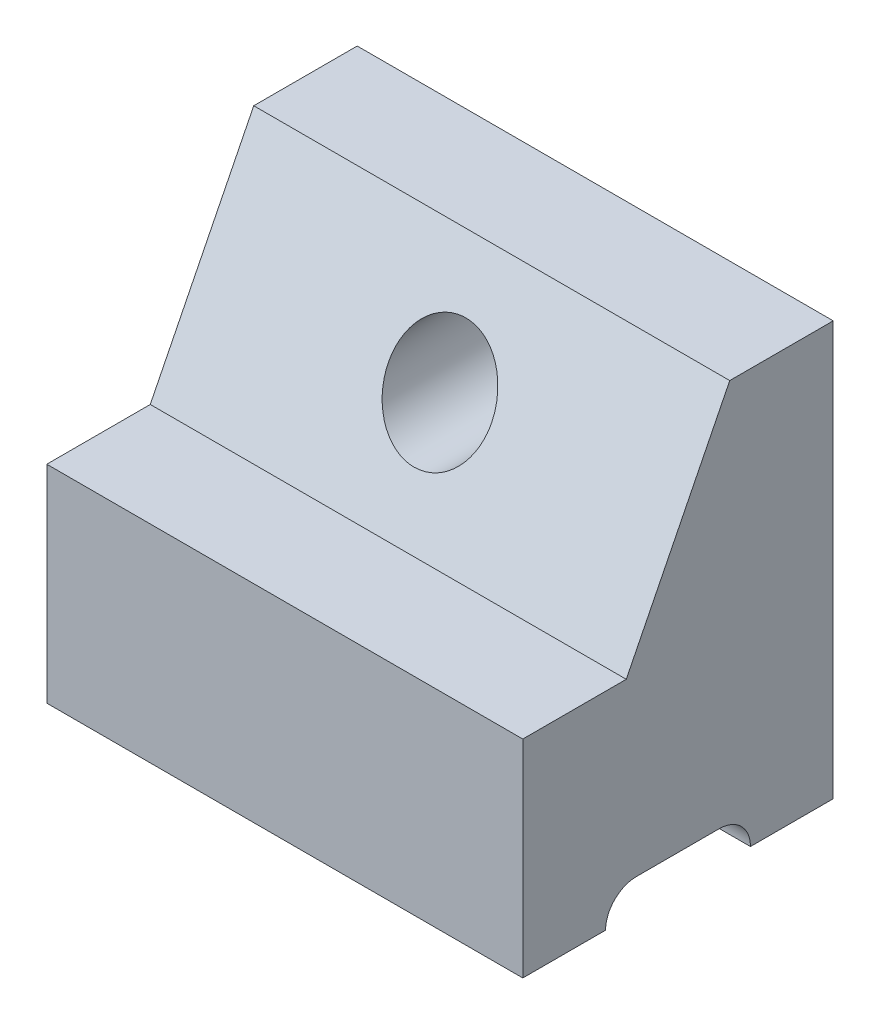
ISO-10303-21;
HEADER;
FILE_DESCRIPTION(('STEP AP214'),'2;1');
FILE_NAME('part.step','',(''),(''),'','','');
FILE_SCHEMA(('AUTOMOTIVE_DESIGN { 1 0 10303 214 1 1 1 1 }'));
ENDSEC;
DATA;
#1=APPLICATION_CONTEXT('core data for automotive mechanical design processes');
#2=APPLICATION_PROTOCOL_DEFINITION('international standard','automotive_design',2000,#1);
#3=PRODUCT_CONTEXT('',#1,'mechanical');
#4=PRODUCT('Part','Part','',(#3));
#5=PRODUCT_RELATED_PRODUCT_CATEGORY('part','',(#4));
#6=PRODUCT_DEFINITION_FORMATION('','',#4);
#7=PRODUCT_DEFINITION_CONTEXT('part definition',#1,'design');
#8=PRODUCT_DEFINITION('design','',#6,#7);
#9=PRODUCT_DEFINITION_SHAPE('','',#8);
#10=(LENGTH_UNIT() NAMED_UNIT(*) SI_UNIT(.MILLI.,.METRE.));
#11=(NAMED_UNIT(*) PLANE_ANGLE_UNIT() SI_UNIT($,.RADIAN.));
#12=(NAMED_UNIT(*) SI_UNIT($,.STERADIAN.) SOLID_ANGLE_UNIT());
#13=UNCERTAINTY_MEASURE_WITH_UNIT(LENGTH_MEASURE(1.E-05),#10,'distance_accuracy_value','');
#14=(GEOMETRIC_REPRESENTATION_CONTEXT(3) GLOBAL_UNCERTAINTY_ASSIGNED_CONTEXT((#13)) GLOBAL_UNIT_ASSIGNED_CONTEXT((#10,
#11,#12)) REPRESENTATION_CONTEXT('',''));
#15=CARTESIAN_POINT('',(0.,0.,0.));
#16=DIRECTION('',(0.,0.,1.));
#17=DIRECTION('',(1.,0.,0.));
#18=AXIS2_PLACEMENT_3D('',#15,#16,#17);
#19=CARTESIAN_POINT('',(-23.,20.,15.));
#20=DIRECTION('',(1.,0.,0.));
#21=DIRECTION('',(0.,1.,0.));
#22=AXIS2_PLACEMENT_3D('',#19,#20,#21);
#23=PLANE('',#22);
#24=DIRECTION('',(0.,-0.894427190999916,0.447213595499958));
#25=VECTOR('',#24,1.);
#26=CARTESIAN_POINT('',(-23.,1.99999999999999,4.));
#27=LINE('',#26,#25);
#28=CARTESIAN_POINT('',(-23.,20.,-5.));
#29=VERTEX_POINT('',#28);
#30=CARTESIAN_POINT('',(-23.,0.,5.));
#31=VERTEX_POINT('',#30);
#32=EDGE_CURVE('E118',#29,#31,#27,.T.);
#33=ORIENTED_EDGE('',*,*,#32,.F.);
#34=DIRECTION('',(0.,0.,-1.));
#35=VECTOR('',#34,1.);
#36=CARTESIAN_POINT('',(-23.,20.,15.));
#37=LINE('',#36,#35);
#38=CARTESIAN_POINT('',(-23.,20.,-15.));
#39=VERTEX_POINT('',#38);
#40=EDGE_CURVE('E195',#29,#39,#37,.T.);
#41=ORIENTED_EDGE('',*,*,#40,.T.);
#42=DIRECTION('',(0.,-1.,0.));
#43=VECTOR('',#42,1.);
#44=CARTESIAN_POINT('',(-23.,20.,-15.));
#45=LINE('',#44,#43);
#46=CARTESIAN_POINT('',(-23.,-20.,-15.));
#47=VERTEX_POINT('',#46);
#48=EDGE_CURVE('E174',#39,#47,#45,.T.);
#49=ORIENTED_EDGE('',*,*,#48,.T.);
#50=DIRECTION('',(0.,0.,-1.));
#51=VECTOR('',#50,1.);
#52=CARTESIAN_POINT('',(-23.,-20.,15.));
#53=LINE('',#52,#51);
#54=CARTESIAN_POINT('',(-23.,-20.,-7.));
#55=VERTEX_POINT('',#54);
#56=EDGE_CURVE('E203',#55,#47,#53,.T.);
#57=ORIENTED_EDGE('',*,*,#56,.F.);
#58=CARTESIAN_POINT('',(-23.,-20.,-4.));
#59=DIRECTION('',(1.,0.,0.));
#60=DIRECTION('',(0.,1.,0.));
#61=AXIS2_PLACEMENT_3D('',#58,#59,#60);
#62=CIRCLE('',#61,3.);
#63=CARTESIAN_POINT('',(-23.,-17.,-4.));
#64=VERTEX_POINT('',#63);
#65=EDGE_CURVE('E11',#55,#64,#62,.T.);
#66=ORIENTED_EDGE('',*,*,#65,.T.);
#67=DIRECTION('',(0.,0.,-1.));
#68=VECTOR('',#67,1.);
#69=CARTESIAN_POINT('',(-23.,-17.,0.));
#70=LINE('',#69,#68);
#71=CARTESIAN_POINT('',(-23.,-17.,4.));
#72=VERTEX_POINT('',#71);
#73=EDGE_CURVE('E150',#72,#64,#70,.T.);
#74=ORIENTED_EDGE('',*,*,#73,.F.);
#75=CARTESIAN_POINT('',(-23.,-20.,4.));
#76=DIRECTION('',(1.,0.,0.));
#77=DIRECTION('',(0.,1.,0.));
#78=AXIS2_PLACEMENT_3D('',#75,#76,#77);
#79=CIRCLE('',#78,3.);
#80=CARTESIAN_POINT('',(-23.,-20.,7.));
#81=VERTEX_POINT('',#80);
#82=EDGE_CURVE('E216',#72,#81,#79,.T.);
#83=ORIENTED_EDGE('',*,*,#82,.T.);
#84=CARTESIAN_POINT('',(-23.,-20.,15.));
#85=VERTEX_POINT('',#84);
#86=EDGE_CURVE('E199',#85,#81,#53,.T.);
#87=ORIENTED_EDGE('',*,*,#86,.F.);
#88=DIRECTION('',(0.,-1.,0.));
#89=VECTOR('',#88,1.);
#90=CARTESIAN_POINT('',(-23.,20.,15.));
#91=LINE('',#90,#89);
#92=CARTESIAN_POINT('',(-23.,0.,15.));
#93=VERTEX_POINT('',#92);
#94=EDGE_CURVE('E137',#93,#85,#91,.T.);
#95=ORIENTED_EDGE('',*,*,#94,.F.);
#96=DIRECTION('',(0.,0.,-1.));
#97=VECTOR('',#96,1.);
#98=CARTESIAN_POINT('',(-23.,0.,0.));
#99=LINE('',#98,#97);
#100=EDGE_CURVE('E56',#93,#31,#99,.T.);
#101=ORIENTED_EDGE('',*,*,#100,.T.);
#102=EDGE_LOOP('',(#33,#41,#49,#57,#66,#74,#83,#87,#95,#101));
#103=FACE_BOUND('',#102,.T.);
#104=ADVANCED_FACE('F39',(#103),#23,.F.);
#105=CARTESIAN_POINT('',(23.,20.,15.));
#106=DIRECTION('',(1.,0.,0.));
#107=DIRECTION('',(0.,1.,0.));
#108=AXIS2_PLACEMENT_3D('',#105,#106,#107);
#109=PLANE('',#108);
#110=DIRECTION('',(0.,0.,-1.));
#111=VECTOR('',#110,1.);
#112=CARTESIAN_POINT('',(23.,20.,15.));
#113=LINE('',#112,#111);
#114=CARTESIAN_POINT('',(23.,20.,-5.));
#115=VERTEX_POINT('',#114);
#116=CARTESIAN_POINT('',(23.,20.,-15.));
#117=VERTEX_POINT('',#116);
#118=EDGE_CURVE('E180',#115,#117,#113,.T.);
#119=ORIENTED_EDGE('',*,*,#118,.F.);
#120=DIRECTION('',(0.,-0.894427190999916,0.447213595499958));
#121=VECTOR('',#120,1.);
#122=CARTESIAN_POINT('',(23.,2.,4.));
#123=LINE('',#122,#121);
#124=CARTESIAN_POINT('',(23.,0.,5.));
#125=VERTEX_POINT('',#124);
#126=EDGE_CURVE('E139',#115,#125,#123,.T.);
#127=ORIENTED_EDGE('',*,*,#126,.T.);
#128=DIRECTION('',(0.,0.,-1.));
#129=VECTOR('',#128,1.);
#130=CARTESIAN_POINT('',(23.,0.,0.));
#131=LINE('',#130,#129);
#132=CARTESIAN_POINT('',(23.,0.,15.));
#133=VERTEX_POINT('',#132);
#134=EDGE_CURVE('E131',#133,#125,#131,.T.);
#135=ORIENTED_EDGE('',*,*,#134,.F.);
#136=DIRECTION('',(0.,-1.,0.));
#137=VECTOR('',#136,1.);
#138=CARTESIAN_POINT('',(23.,20.,15.));
#139=LINE('',#138,#137);
#140=CARTESIAN_POINT('',(23.,-20.,15.));
#141=VERTEX_POINT('',#140);
#142=EDGE_CURVE('E170',#133,#141,#139,.T.);
#143=ORIENTED_EDGE('',*,*,#142,.T.);
#144=DIRECTION('',(0.,0.,-1.));
#145=VECTOR('',#144,1.);
#146=CARTESIAN_POINT('',(23.,-20.,15.));
#147=LINE('',#146,#145);
#148=CARTESIAN_POINT('',(23.,-20.,7.));
#149=VERTEX_POINT('',#148);
#150=EDGE_CURVE('E204',#141,#149,#147,.T.);
#151=ORIENTED_EDGE('',*,*,#150,.T.);
#152=CARTESIAN_POINT('',(23.,-20.,4.));
#153=DIRECTION('',(1.,0.,0.));
#154=DIRECTION('',(0.,1.,0.));
#155=AXIS2_PLACEMENT_3D('',#152,#153,#154);
#156=CIRCLE('',#155,3.);
#157=CARTESIAN_POINT('',(23.,-17.,4.));
#158=VERTEX_POINT('',#157);
#159=EDGE_CURVE('E213',#149,#158,#156,.F.);
#160=ORIENTED_EDGE('',*,*,#159,.T.);
#161=DIRECTION('',(0.,0.,-1.));
#162=VECTOR('',#161,1.);
#163=CARTESIAN_POINT('',(23.,-17.,0.));
#164=LINE('',#163,#162);
#165=CARTESIAN_POINT('',(23.,-17.,-4.));
#166=VERTEX_POINT('',#165);
#167=EDGE_CURVE('E154',#158,#166,#164,.T.);
#168=ORIENTED_EDGE('',*,*,#167,.T.);
#169=CARTESIAN_POINT('',(23.,-20.,-4.));
#170=DIRECTION('',(1.,0.,0.));
#171=DIRECTION('',(0.,1.,0.));
#172=AXIS2_PLACEMENT_3D('',#169,#170,#171);
#173=CIRCLE('',#172,3.);
#174=CARTESIAN_POINT('',(23.,-20.,-7.));
#175=VERTEX_POINT('',#174);
#176=EDGE_CURVE('E49',#166,#175,#173,.F.);
#177=ORIENTED_EDGE('',*,*,#176,.T.);
#178=CARTESIAN_POINT('',(23.,-20.,-15.));
#179=VERTEX_POINT('',#178);
#180=EDGE_CURVE('E208',#175,#179,#147,.T.);
#181=ORIENTED_EDGE('',*,*,#180,.T.);
#182=DIRECTION('',(0.,-1.,0.));
#183=VECTOR('',#182,1.);
#184=CARTESIAN_POINT('',(23.,20.,-15.));
#185=LINE('',#184,#183);
#186=EDGE_CURVE('E184',#117,#179,#185,.T.);
#187=ORIENTED_EDGE('',*,*,#186,.F.);
#188=EDGE_LOOP('',(#119,#127,#135,#143,#151,#160,#168,#177,#181,#187));
#189=FACE_BOUND('',#188,.T.);
#190=ADVANCED_FACE('F227',(#189),#109,.T.);
#191=CARTESIAN_POINT('',(-23.,20.,15.));
#192=DIRECTION('',(0.,1.,0.));
#193=DIRECTION('',(0.,0.,1.));
#194=AXIS2_PLACEMENT_3D('',#191,#192,#193);
#195=PLANE('',#194);
#196=ORIENTED_EDGE('',*,*,#40,.F.);
#197=DIRECTION('',(1.,0.,0.));
#198=VECTOR('',#197,1.);
#199=CARTESIAN_POINT('',(-23.,20.,-5.));
#200=LINE('',#199,#198);
#201=EDGE_CURVE('E124',#29,#115,#200,.T.);
#202=ORIENTED_EDGE('',*,*,#201,.T.);
#203=ORIENTED_EDGE('',*,*,#118,.T.);
#204=DIRECTION('',(1.,0.,0.));
#205=VECTOR('',#204,1.);
#206=CARTESIAN_POINT('',(-23.,20.,-15.));
#207=LINE('',#206,#205);
#208=EDGE_CURVE('E169',#39,#117,#207,.T.);
#209=ORIENTED_EDGE('',*,*,#208,.F.);
#210=EDGE_LOOP('',(#196,#202,#203,#209));
#211=FACE_BOUND('',#210,.T.);
#212=ADVANCED_FACE('F266',(#211),#195,.T.);
#213=CARTESIAN_POINT('',(0.,10.,-15.));
#214=DIRECTION('',(0.,0.,1.));
#215=DIRECTION('',(1.,0.,0.));
#216=AXIS2_PLACEMENT_3D('',#213,#214,#215);
#217=CYLINDRICAL_SURFACE('',#216,5.);
#218=CARTESIAN_POINT('',(0.,10.,-15.));
#219=DIRECTION('',(0.,0.,1.));
#220=DIRECTION('',(1.,0.,0.));
#221=AXIS2_PLACEMENT_3D('',#218,#219,#220);
#222=CIRCLE('',#221,5.);
#223=CARTESIAN_POINT('',(5.,10.,-15.));
#224=VERTEX_POINT('',#223);
#225=EDGE_CURVE('E162',#224,#224,#222,.T.);
#226=ORIENTED_EDGE('',*,*,#225,.F.);
#227=EDGE_LOOP('',(#226));
#228=FACE_BOUND('',#227,.T.);
#229=CARTESIAN_POINT('',(0.,10.,0.));
#230=DIRECTION('',(0.,0.447213595499958,0.894427190999916));
#231=DIRECTION('',(0.,-0.894427190999916,0.447213595499958));
#232=AXIS2_PLACEMENT_3D('',#229,#230,#231);
#233=ELLIPSE('',#232,5.59016994374948,5.);
#234=CARTESIAN_POINT('',(0.,5.00000000000001,2.5));
#235=VERTEX_POINT('',#234);
#236=EDGE_CURVE('E43',#235,#235,#233,.F.);
#237=ORIENTED_EDGE('',*,*,#236,.F.);
#238=EDGE_LOOP('',(#237));
#239=FACE_BOUND('',#238,.T.);
#240=ADVANCED_FACE('F270',(#228,#239),#217,.F.);
#241=CARTESIAN_POINT('',(-23.,-20.,15.));
#242=DIRECTION('',(0.,1.,0.));
#243=DIRECTION('',(0.,0.,1.));
#244=AXIS2_PLACEMENT_3D('',#241,#242,#243);
#245=PLANE('',#244);
#246=DIRECTION('',(1.,0.,0.));
#247=VECTOR('',#246,1.);
#248=CARTESIAN_POINT('',(-23.,-20.,7.));
#249=LINE('',#248,#247);
#250=EDGE_CURVE('E158',#81,#149,#249,.T.);
#251=ORIENTED_EDGE('',*,*,#250,.T.);
#252=ORIENTED_EDGE('',*,*,#150,.F.);
#253=DIRECTION('',(1.,0.,0.));
#254=VECTOR('',#253,1.);
#255=CARTESIAN_POINT('',(-23.,-20.,15.));
#256=LINE('',#255,#254);
#257=EDGE_CURVE('E173',#85,#141,#256,.T.);
#258=ORIENTED_EDGE('',*,*,#257,.F.);
#259=ORIENTED_EDGE('',*,*,#86,.T.);
#260=EDGE_LOOP('',(#251,#252,#258,#259));
#261=FACE_BOUND('',#260,.T.);
#262=ADVANCED_FACE('F245',(#261),#245,.F.);
#263=ORIENTED_EDGE('',*,*,#180,.F.);
#264=DIRECTION('',(1.,0.,0.));
#265=VECTOR('',#264,1.);
#266=CARTESIAN_POINT('',(-23.,-20.,-7.));
#267=LINE('',#266,#265);
#268=EDGE_CURVE('E153',#55,#175,#267,.T.);
#269=ORIENTED_EDGE('',*,*,#268,.F.);
#270=ORIENTED_EDGE('',*,*,#56,.T.);
#271=DIRECTION('',(1.,0.,0.));
#272=VECTOR('',#271,1.);
#273=CARTESIAN_POINT('',(-23.,-20.,-15.));
#274=LINE('',#273,#272);
#275=EDGE_CURVE('E188',#47,#179,#274,.T.);
#276=ORIENTED_EDGE('',*,*,#275,.T.);
#277=EDGE_LOOP('',(#263,#269,#270,#276));
#278=FACE_BOUND('',#277,.T.);
#279=ADVANCED_FACE('F233',(#278),#245,.F.);
#280=CARTESIAN_POINT('',(0.,0.,15.));
#281=DIRECTION('',(0.,0.,-1.));
#282=DIRECTION('',(-1.,0.,0.));
#283=AXIS2_PLACEMENT_3D('',#280,#281,#282);
#284=PLANE('',#283);
#285=ORIENTED_EDGE('',*,*,#142,.F.);
#286=DIRECTION('',(1.,0.,0.));
#287=VECTOR('',#286,1.);
#288=CARTESIAN_POINT('',(-23.,0.,15.));
#289=LINE('',#288,#287);
#290=EDGE_CURVE('E127',#93,#133,#289,.T.);
#291=ORIENTED_EDGE('',*,*,#290,.F.);
#292=ORIENTED_EDGE('',*,*,#94,.T.);
#293=ORIENTED_EDGE('',*,*,#257,.T.);
#294=EDGE_LOOP('',(#285,#291,#292,#293));
#295=FACE_BOUND('',#294,.T.);
#296=ADVANCED_FACE('F249',(#295),#284,.F.);
#297=CARTESIAN_POINT('',(0.,0.,-15.));
#298=DIRECTION('',(0.,0.,-1.));
#299=DIRECTION('',(-1.,0.,0.));
#300=AXIS2_PLACEMENT_3D('',#297,#298,#299);
#301=PLANE('',#300);
#302=ORIENTED_EDGE('',*,*,#225,.T.);
#303=EDGE_LOOP('',(#302));
#304=FACE_BOUND('',#303,.T.);
#305=ORIENTED_EDGE('',*,*,#208,.T.);
#306=ORIENTED_EDGE('',*,*,#186,.T.);
#307=ORIENTED_EDGE('',*,*,#275,.F.);
#308=ORIENTED_EDGE('',*,*,#48,.F.);
#309=EDGE_LOOP('',(#305,#306,#307,#308));
#310=FACE_BOUND('',#309,.T.);
#311=ADVANCED_FACE('F251',(#304,#310),#301,.T.);
#312=CARTESIAN_POINT('',(-23.,-17.,0.));
#313=DIRECTION('',(0.,-1.,0.));
#314=DIRECTION('',(1.,0.,0.));
#315=AXIS2_PLACEMENT_3D('',#312,#313,#314);
#316=PLANE('',#315);
#317=ORIENTED_EDGE('',*,*,#73,.T.);
#318=DIRECTION('',(1.,0.,0.));
#319=VECTOR('',#318,1.);
#320=CARTESIAN_POINT('',(-23.,-17.,-4.));
#321=LINE('',#320,#319);
#322=EDGE_CURVE('E219',#64,#166,#321,.T.);
#323=ORIENTED_EDGE('',*,*,#322,.T.);
#324=ORIENTED_EDGE('',*,*,#167,.F.);
#325=DIRECTION('',(1.,0.,0.));
#326=VECTOR('',#325,1.);
#327=CARTESIAN_POINT('',(-23.,-17.,4.));
#328=LINE('',#327,#326);
#329=EDGE_CURVE('E198',#158,#72,#328,.F.);
#330=ORIENTED_EDGE('',*,*,#329,.T.);
#331=EDGE_LOOP('',(#317,#323,#324,#330));
#332=FACE_BOUND('',#331,.T.);
#333=ADVANCED_FACE('F237',(#332),#316,.T.);
#334=CARTESIAN_POINT('',(-23.,-20.,4.));
#335=DIRECTION('',(-1.,0.,0.));
#336=DIRECTION('',(0.,-1.,0.));
#337=AXIS2_PLACEMENT_3D('',#334,#335,#336);
#338=CYLINDRICAL_SURFACE('',#337,3.);
#339=ORIENTED_EDGE('',*,*,#82,.F.);
#340=ORIENTED_EDGE('',*,*,#329,.F.);
#341=ORIENTED_EDGE('',*,*,#159,.F.);
#342=ORIENTED_EDGE('',*,*,#250,.F.);
#343=EDGE_LOOP('',(#339,#340,#341,#342));
#344=FACE_BOUND('',#343,.T.);
#345=ADVANCED_FACE('F242',(#344),#338,.F.);
#346=CARTESIAN_POINT('',(-23.,-20.,-4.));
#347=DIRECTION('',(1.,0.,0.));
#348=DIRECTION('',(0.,1.,0.));
#349=AXIS2_PLACEMENT_3D('',#346,#347,#348);
#350=CYLINDRICAL_SURFACE('',#349,3.);
#351=ORIENTED_EDGE('',*,*,#65,.F.);
#352=ORIENTED_EDGE('',*,*,#268,.T.);
#353=ORIENTED_EDGE('',*,*,#176,.F.);
#354=ORIENTED_EDGE('',*,*,#322,.F.);
#355=EDGE_LOOP('',(#351,#352,#353,#354));
#356=FACE_BOUND('',#355,.T.);
#357=ADVANCED_FACE('F41',(#356),#350,.F.);
#358=CARTESIAN_POINT('',(-23.,1.99999999999999,4.));
#359=DIRECTION('',(0.,0.447213595499958,0.894427190999916));
#360=DIRECTION('',(0.,-0.894427190999916,0.447213595499958));
#361=AXIS2_PLACEMENT_3D('',#358,#359,#360);
#362=PLANE('',#361);
#363=ORIENTED_EDGE('',*,*,#126,.F.);
#364=ORIENTED_EDGE('',*,*,#201,.F.);
#365=ORIENTED_EDGE('',*,*,#32,.T.);
#366=DIRECTION('',(1.,0.,0.));
#367=VECTOR('',#366,1.);
#368=CARTESIAN_POINT('',(-23.,0.,5.));
#369=LINE('',#368,#367);
#370=EDGE_CURVE('E121',#31,#125,#369,.T.);
#371=ORIENTED_EDGE('',*,*,#370,.T.);
#372=EDGE_LOOP('',(#363,#364,#365,#371));
#373=FACE_BOUND('',#372,.T.);
#374=ORIENTED_EDGE('',*,*,#236,.T.);
#375=EDGE_LOOP('',(#374));
#376=FACE_BOUND('',#375,.T.);
#377=ADVANCED_FACE('F119',(#373,#376),#362,.T.);
#378=CARTESIAN_POINT('',(-23.,0.,0.));
#379=DIRECTION('',(0.,-1.,0.));
#380=DIRECTION('',(1.,0.,0.));
#381=AXIS2_PLACEMENT_3D('',#378,#379,#380);
#382=PLANE('',#381);
#383=ORIENTED_EDGE('',*,*,#134,.T.);
#384=ORIENTED_EDGE('',*,*,#370,.F.);
#385=ORIENTED_EDGE('',*,*,#100,.F.);
#386=ORIENTED_EDGE('',*,*,#290,.T.);
#387=EDGE_LOOP('',(#383,#384,#385,#386));
#388=FACE_BOUND('',#387,.T.);
#389=ADVANCED_FACE('F129',(#388),#382,.F.);
#390=CLOSED_SHELL('',(#104,#190,#212,#240,#262,#279,#296,#311,#333,#345,#357,#377,#389));
#391=MANIFOLD_SOLID_BREP('B2',#390);
#392=ADVANCED_BREP_SHAPE_REPRESENTATION('',(#18,#391),#14);
#393=SHAPE_DEFINITION_REPRESENTATION(#9,#392);
ENDSEC;
END-ISO-10303-21;
